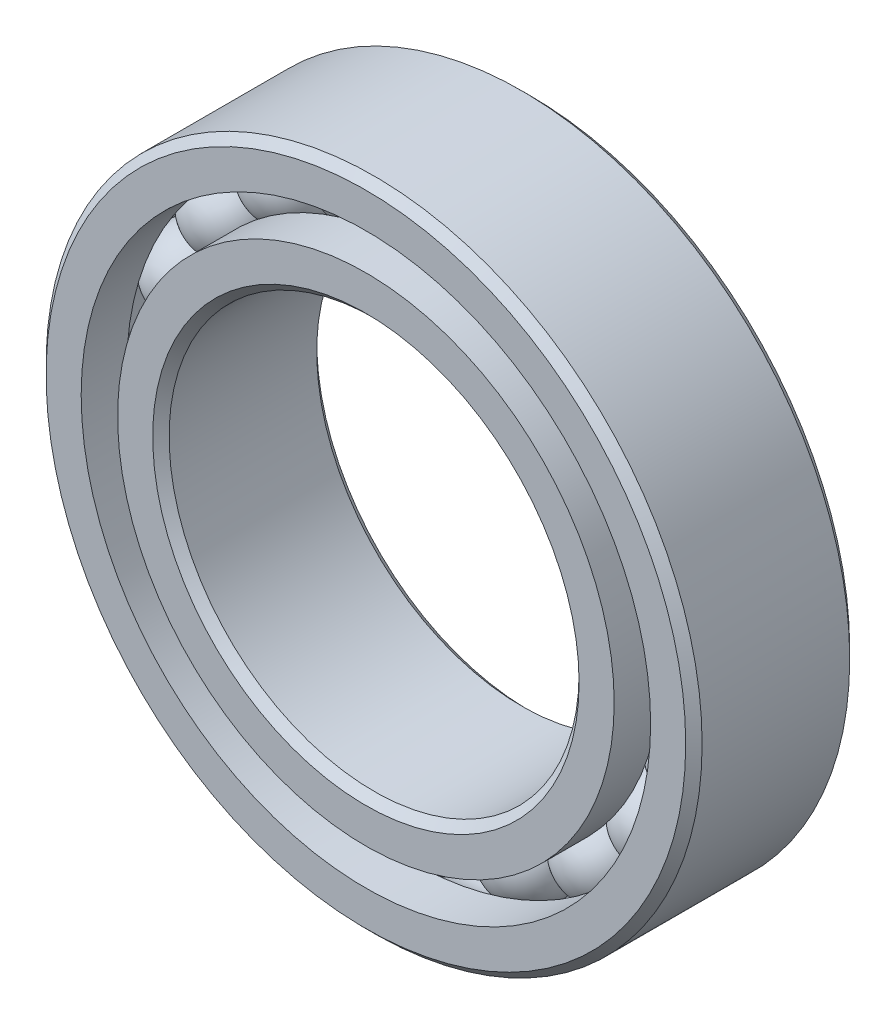
ISO-10303-21;
HEADER;
FILE_DESCRIPTION(('STEP AP214'),'2;1');
FILE_NAME('part.step','',(''),(''),'','','');
FILE_SCHEMA(('AUTOMOTIVE_DESIGN { 1 0 10303 214 1 1 1 1 }'));
ENDSEC;
DATA;
#1=APPLICATION_CONTEXT('core data for automotive mechanical design processes');
#2=APPLICATION_PROTOCOL_DEFINITION('international standard','automotive_design',2000,#1);
#3=PRODUCT_CONTEXT('',#1,'mechanical');
#4=PRODUCT('Part','Part','',(#3));
#5=PRODUCT_RELATED_PRODUCT_CATEGORY('part','',(#4));
#6=PRODUCT_DEFINITION_FORMATION('','',#4);
#7=PRODUCT_DEFINITION_CONTEXT('part definition',#1,'design');
#8=PRODUCT_DEFINITION('design','',#6,#7);
#9=PRODUCT_DEFINITION_SHAPE('','',#8);
#10=(LENGTH_UNIT() NAMED_UNIT(*) SI_UNIT(.MILLI.,.METRE.));
#11=(NAMED_UNIT(*) PLANE_ANGLE_UNIT() SI_UNIT($,.RADIAN.));
#12=(NAMED_UNIT(*) SI_UNIT($,.STERADIAN.) SOLID_ANGLE_UNIT());
#13=UNCERTAINTY_MEASURE_WITH_UNIT(LENGTH_MEASURE(1.E-05),#10,'distance_accuracy_value','');
#14=(GEOMETRIC_REPRESENTATION_CONTEXT(3) GLOBAL_UNCERTAINTY_ASSIGNED_CONTEXT((#13)) GLOBAL_UNIT_ASSIGNED_CONTEXT((#10,
#11,#12)) REPRESENTATION_CONTEXT('',''));
#15=CARTESIAN_POINT('',(0.,0.,0.));
#16=DIRECTION('',(0.,0.,1.));
#17=DIRECTION('',(1.,0.,0.));
#18=AXIS2_PLACEMENT_3D('',#15,#16,#17);
#19=CARTESIAN_POINT('',(-1.00430523171854,3.09093367795926,0.));
#20=DIRECTION('',(0.,0.,1.));
#21=DIRECTION('',(-0.309016994374935,0.951056516295158,0.));
#22=AXIS2_PLACEMENT_3D('',#19,#20,#21);
#23=SPHERICAL_SURFACE('',#22,0.496903994999954);
#24=CARTESIAN_POINT('',(-1.00430523171854,3.09093367795926,0.496903994999954));
#25=VERTEX_POINT('',#24);
#26=VERTEX_LOOP('',#25);
#27=FACE_BOUND('',#26,.T.);
#28=ADVANCED_FACE('F39',(#27),#23,.T.);
#29=CLOSED_SHELL('',(#28));
#30=MANIFOLD_SOLID_BREP('B2',#29);
#31=CARTESIAN_POINT('',(-1.9103020699505,2.6293052317186,0.));
#32=DIRECTION('',(0.,0.,1.));
#33=DIRECTION('',(-0.587785252292462,0.809016994374955,0.));
#34=AXIS2_PLACEMENT_3D('',#31,#32,#33);
#35=SPHERICAL_SURFACE('',#34,0.496903994999954);
#36=CARTESIAN_POINT('',(-1.9103020699505,2.6293052317186,0.496903994999954));
#37=VERTEX_POINT('',#36);
#38=VERTEX_LOOP('',#37);
#39=FACE_BOUND('',#38,.T.);
#40=ADVANCED_FACE('F57',(#39),#35,.T.);
#41=CLOSED_SHELL('',(#40));
#42=MANIFOLD_SOLID_BREP('B6',#41);
#43=CARTESIAN_POINT('',(-2.62930523171856,1.91030206995057,0.));
#44=DIRECTION('',(0.,0.,1.));
#45=DIRECTION('',(-0.80901699437494,0.587785252292483,0.));
#46=AXIS2_PLACEMENT_3D('',#43,#44,#45);
#47=SPHERICAL_SURFACE('',#46,0.496903994999954);
#48=CARTESIAN_POINT('',(-2.62930523171856,1.91030206995057,0.496903994999954));
#49=VERTEX_POINT('',#48);
#50=VERTEX_LOOP('',#49);
#51=FACE_BOUND('',#50,.T.);
#52=ADVANCED_FACE('F75',(#51),#47,.T.);
#53=CLOSED_SHELL('',(#52));
#54=MANIFOLD_SOLID_BREP('B35',#53);
#55=CARTESIAN_POINT('',(-3.09093367795924,1.00430523171861,0.));
#56=DIRECTION('',(0.,0.,1.));
#57=DIRECTION('',(-0.95105651629515,0.309016994374958,0.));
#58=AXIS2_PLACEMENT_3D('',#55,#56,#57);
#59=SPHERICAL_SURFACE('',#58,0.496903994999954);
#60=CARTESIAN_POINT('',(-3.09093367795924,1.00430523171861,0.496903994999954));
#61=VERTEX_POINT('',#60);
#62=VERTEX_LOOP('',#61);
#63=FACE_BOUND('',#62,.T.);
#64=ADVANCED_FACE('F93',(#63),#59,.T.);
#65=CLOSED_SHELL('',(#64));
#66=MANIFOLD_SOLID_BREP('B53',#65);
#67=CARTESIAN_POINT('',(-3.25,0.,0.));
#68=DIRECTION('',(0.,0.,1.));
#69=DIRECTION('',(-1.,0.,0.));
#70=AXIS2_PLACEMENT_3D('',#67,#68,#69);
#71=SPHERICAL_SURFACE('',#70,0.496903994999954);
#72=CARTESIAN_POINT('',(-3.25,0.,0.496903994999954));
#73=VERTEX_POINT('',#72);
#74=VERTEX_LOOP('',#73);
#75=FACE_BOUND('',#74,.T.);
#76=ADVANCED_FACE('F111',(#75),#71,.T.);
#77=CLOSED_SHELL('',(#76));
#78=MANIFOLD_SOLID_BREP('B71',#77);
#79=CARTESIAN_POINT('',(-3.09093367795926,-1.00430523171855,0.));
#80=DIRECTION('',(0.,0.,1.));
#81=DIRECTION('',(-0.951056516295157,-0.309016994374938,0.));
#82=AXIS2_PLACEMENT_3D('',#79,#80,#81);
#83=SPHERICAL_SURFACE('',#82,0.496903994999954);
#84=CARTESIAN_POINT('',(-3.09093367795926,-1.00430523171855,0.496903994999954));
#85=VERTEX_POINT('',#84);
#86=VERTEX_LOOP('',#85);
#87=FACE_BOUND('',#86,.T.);
#88=ADVANCED_FACE('F142',(#87),#83,.T.);
#89=CLOSED_SHELL('',(#88));
#90=MANIFOLD_SOLID_BREP('B89',#89);
#91=CARTESIAN_POINT('',(-2.6293052317186,-1.91030206995051,0.));
#92=DIRECTION('',(0.,0.,1.));
#93=DIRECTION('',(-0.809016994374953,-0.587785252292465,0.));
#94=AXIS2_PLACEMENT_3D('',#91,#92,#93);
#95=SPHERICAL_SURFACE('',#94,0.496903994999954);
#96=CARTESIAN_POINT('',(-2.6293052317186,-1.91030206995051,0.496903994999954));
#97=VERTEX_POINT('',#96);
#98=VERTEX_LOOP('',#97);
#99=FACE_BOUND('',#98,.T.);
#100=ADVANCED_FACE('F173',(#99),#95,.T.);
#101=CLOSED_SHELL('',(#100));
#102=MANIFOLD_SOLID_BREP('B107',#101);
#103=CARTESIAN_POINT('',(-1.91030206995056,-2.62930523171856,0.));
#104=DIRECTION('',(0.,0.,1.));
#105=DIRECTION('',(-0.58778525229248,-0.809016994374942,0.));
#106=AXIS2_PLACEMENT_3D('',#103,#104,#105);
#107=SPHERICAL_SURFACE('',#106,0.496903994999954);
#108=CARTESIAN_POINT('',(-1.91030206995056,-2.62930523171856,0.496903994999954));
#109=VERTEX_POINT('',#108);
#110=VERTEX_LOOP('',#109);
#111=FACE_BOUND('',#110,.T.);
#112=ADVANCED_FACE('F204',(#111),#107,.T.);
#113=CLOSED_SHELL('',(#112));
#114=MANIFOLD_SOLID_BREP('B138',#113);
#115=CARTESIAN_POINT('',(-1.0043052317186,-3.09093367795924,0.));
#116=DIRECTION('',(0.,0.,1.));
#117=DIRECTION('',(-0.309016994374955,-0.951056516295151,0.));
#118=AXIS2_PLACEMENT_3D('',#115,#116,#117);
#119=SPHERICAL_SURFACE('',#118,0.496903994999954);
#120=CARTESIAN_POINT('',(-1.0043052317186,-3.09093367795924,0.496903994999954));
#121=VERTEX_POINT('',#120);
#122=VERTEX_LOOP('',#121);
#123=FACE_BOUND('',#122,.T.);
#124=ADVANCED_FACE('F235',(#123),#119,.T.);
#125=CLOSED_SHELL('',(#124));
#126=MANIFOLD_SOLID_BREP('B169',#125);
#127=CARTESIAN_POINT('',(0.,-3.25,0.));
#128=DIRECTION('',(0.,0.,1.));
#129=DIRECTION('',(0.,-1.,0.));
#130=AXIS2_PLACEMENT_3D('',#127,#128,#129);
#131=SPHERICAL_SURFACE('',#130,0.496903994999954);
#132=CARTESIAN_POINT('',(0.,-3.25,0.496903994999954));
#133=VERTEX_POINT('',#132);
#134=VERTEX_LOOP('',#133);
#135=FACE_BOUND('',#134,.T.);
#136=ADVANCED_FACE('F266',(#135),#131,.T.);
#137=CLOSED_SHELL('',(#136));
#138=MANIFOLD_SOLID_BREP('B200',#137);
#139=CARTESIAN_POINT('',(1.00430523171856,-3.09093367795926,0.));
#140=DIRECTION('',(0.,0.,1.));
#141=DIRECTION('',(0.309016994374941,-0.951056516295156,0.));
#142=AXIS2_PLACEMENT_3D('',#139,#140,#141);
#143=SPHERICAL_SURFACE('',#142,0.496903994999954);
#144=CARTESIAN_POINT('',(1.00430523171856,-3.09093367795926,0.496903994999954));
#145=VERTEX_POINT('',#144);
#146=VERTEX_LOOP('',#145);
#147=FACE_BOUND('',#146,.T.);
#148=ADVANCED_FACE('F297',(#147),#143,.T.);
#149=CLOSED_SHELL('',(#148));
#150=MANIFOLD_SOLID_BREP('B231',#149);
#151=CARTESIAN_POINT('',(1.91030206995052,-2.62930523171859,0.));
#152=DIRECTION('',(0.,0.,1.));
#153=DIRECTION('',(0.587785252292469,-0.809016994374951,0.));
#154=AXIS2_PLACEMENT_3D('',#151,#152,#153);
#155=SPHERICAL_SURFACE('',#154,0.496903994999954);
#156=CARTESIAN_POINT('',(1.91030206995052,-2.62930523171859,0.496903994999954));
#157=VERTEX_POINT('',#156);
#158=VERTEX_LOOP('',#157);
#159=FACE_BOUND('',#158,.T.);
#160=ADVANCED_FACE('F328',(#159),#155,.T.);
#161=CLOSED_SHELL('',(#160));
#162=MANIFOLD_SOLID_BREP('B262',#161);
#163=CARTESIAN_POINT('',(2.62930523171857,-1.91030206995055,0.));
#164=DIRECTION('',(0.,0.,1.));
#165=DIRECTION('',(0.809016994374945,-0.587785252292477,0.));
#166=AXIS2_PLACEMENT_3D('',#163,#164,#165);
#167=SPHERICAL_SURFACE('',#166,0.496903994999954);
#168=CARTESIAN_POINT('',(2.62930523171857,-1.91030206995055,0.496903994999954));
#169=VERTEX_POINT('',#168);
#170=VERTEX_LOOP('',#169);
#171=FACE_BOUND('',#170,.T.);
#172=ADVANCED_FACE('F359',(#171),#167,.T.);
#173=CLOSED_SHELL('',(#172));
#174=MANIFOLD_SOLID_BREP('B293',#173);
#175=CARTESIAN_POINT('',(3.09093367795925,-1.00430523171859,0.));
#176=DIRECTION('',(0.,0.,1.));
#177=DIRECTION('',(0.951056516295152,-0.309016994374952,0.));
#178=AXIS2_PLACEMENT_3D('',#175,#176,#177);
#179=SPHERICAL_SURFACE('',#178,0.496903994999954);
#180=CARTESIAN_POINT('',(3.09093367795925,-1.00430523171859,0.496903994999954));
#181=VERTEX_POINT('',#180);
#182=VERTEX_LOOP('',#181);
#183=FACE_BOUND('',#182,.T.);
#184=ADVANCED_FACE('F390',(#183),#179,.T.);
#185=CLOSED_SHELL('',(#184));
#186=MANIFOLD_SOLID_BREP('B324',#185);
#187=CARTESIAN_POINT('',(3.25,0.,0.));
#188=DIRECTION('',(0.,0.,1.));
#189=DIRECTION('',(1.,0.,0.));
#190=AXIS2_PLACEMENT_3D('',#187,#188,#189);
#191=SPHERICAL_SURFACE('',#190,0.496903994999954);
#192=CARTESIAN_POINT('',(3.25,0.,0.496903994999954));
#193=VERTEX_POINT('',#192);
#194=VERTEX_LOOP('',#193);
#195=FACE_BOUND('',#194,.T.);
#196=ADVANCED_FACE('F421',(#195),#191,.T.);
#197=CLOSED_SHELL('',(#196));
#198=MANIFOLD_SOLID_BREP('B355',#197);
#199=CARTESIAN_POINT('',(3.09093367795925,1.00430523171857,0.));
#200=DIRECTION('',(0.,0.,1.));
#201=DIRECTION('',(0.951056516295155,0.309016994374945,0.));
#202=AXIS2_PLACEMENT_3D('',#199,#200,#201);
#203=SPHERICAL_SURFACE('',#202,0.496903994999954);
#204=CARTESIAN_POINT('',(3.09093367795925,1.00430523171857,0.496903994999954));
#205=VERTEX_POINT('',#204);
#206=VERTEX_LOOP('',#205);
#207=FACE_BOUND('',#206,.T.);
#208=ADVANCED_FACE('F452',(#207),#203,.T.);
#209=CLOSED_SHELL('',(#208));
#210=MANIFOLD_SOLID_BREP('B386',#209);
#211=CARTESIAN_POINT('',(2.62930523171858,1.91030206995053,0.));
#212=DIRECTION('',(0.,0.,1.));
#213=DIRECTION('',(0.809016994374949,0.587785252292471,0.));
#214=AXIS2_PLACEMENT_3D('',#211,#212,#213);
#215=SPHERICAL_SURFACE('',#214,0.496903994999954);
#216=CARTESIAN_POINT('',(2.62930523171858,1.91030206995053,0.496903994999954));
#217=VERTEX_POINT('',#216);
#218=VERTEX_LOOP('',#217);
#219=FACE_BOUND('',#218,.T.);
#220=ADVANCED_FACE('F483',(#219),#215,.T.);
#221=CLOSED_SHELL('',(#220));
#222=MANIFOLD_SOLID_BREP('B417',#221);
#223=CARTESIAN_POINT('',(1.91030206995054,2.62930523171858,0.));
#224=DIRECTION('',(0.,0.,1.));
#225=DIRECTION('',(0.587785252292474,0.809016994374947,0.));
#226=AXIS2_PLACEMENT_3D('',#223,#224,#225);
#227=SPHERICAL_SURFACE('',#226,0.496903994999954);
#228=CARTESIAN_POINT('',(1.91030206995054,2.62930523171858,0.496903994999954));
#229=VERTEX_POINT('',#228);
#230=VERTEX_LOOP('',#229);
#231=FACE_BOUND('',#230,.T.);
#232=ADVANCED_FACE('F514',(#231),#227,.T.);
#233=CLOSED_SHELL('',(#232));
#234=MANIFOLD_SOLID_BREP('B448',#233);
#235=CARTESIAN_POINT('',(1.00430523171858,3.09093367795925,0.));
#236=DIRECTION('',(0.,0.,1.));
#237=DIRECTION('',(0.309016994374948,0.951056516295154,0.));
#238=AXIS2_PLACEMENT_3D('',#235,#236,#237);
#239=SPHERICAL_SURFACE('',#238,0.496903994999954);
#240=CARTESIAN_POINT('',(1.00430523171858,3.09093367795925,0.496903994999954));
#241=VERTEX_POINT('',#240);
#242=VERTEX_LOOP('',#241);
#243=FACE_BOUND('',#242,.T.);
#244=ADVANCED_FACE('F545',(#243),#239,.T.);
#245=CLOSED_SHELL('',(#244));
#246=MANIFOLD_SOLID_BREP('B479',#245);
#247=CARTESIAN_POINT('',(0.,3.25,0.));
#248=DIRECTION('',(0.,0.,1.));
#249=DIRECTION('',(0.,1.,0.));
#250=AXIS2_PLACEMENT_3D('',#247,#248,#249);
#251=SPHERICAL_SURFACE('',#250,0.496903994999954);
#252=CARTESIAN_POINT('',(0.,3.25,0.496903994999954));
#253=VERTEX_POINT('',#252);
#254=VERTEX_LOOP('',#253);
#255=FACE_BOUND('',#254,.T.);
#256=ADVANCED_FACE('F578',(#255),#251,.T.);
#257=CLOSED_SHELL('',(#256));
#258=MANIFOLD_SOLID_BREP('B510',#257);
#259=CARTESIAN_POINT('',(0.,0.,0.900000000000001));
#260=DIRECTION('',(0.,0.,-1.));
#261=DIRECTION('',(-1.,0.,0.));
#262=AXIS2_PLACEMENT_3D('',#259,#260,#261);
#263=CONICAL_SURFACE('',#262,4.,0.785398163397447);
#264=CARTESIAN_POINT('',(0.,0.,1.));
#265=DIRECTION('',(0.,0.,1.));
#266=DIRECTION('',(1.,0.,0.));
#267=AXIS2_PLACEMENT_3D('',#264,#265,#266);
#268=CIRCLE('',#267,3.9);
#269=CARTESIAN_POINT('',(3.9,0.,1.));
#270=VERTEX_POINT('',#269);
#271=EDGE_CURVE('E625',#270,#270,#268,.T.);
#272=ORIENTED_EDGE('',*,*,#271,.F.);
#273=EDGE_LOOP('',(#272));
#274=FACE_BOUND('',#273,.T.);
#275=CARTESIAN_POINT('',(0.,0.,0.900000000000001));
#276=DIRECTION('',(0.,0.,1.));
#277=DIRECTION('',(1.,0.,0.));
#278=AXIS2_PLACEMENT_3D('',#275,#276,#277);
#279=CIRCLE('',#278,4.);
#280=CARTESIAN_POINT('',(4.,0.,0.900000000000001));
#281=VERTEX_POINT('',#280);
#282=EDGE_CURVE('E577',#281,#281,#279,.T.);
#283=ORIENTED_EDGE('',*,*,#282,.T.);
#284=EDGE_LOOP('',(#283));
#285=FACE_BOUND('',#284,.T.);
#286=ADVANCED_FACE('F597',(#274,#285),#263,.T.);
#287=CARTESIAN_POINT('',(0.,0.,1.));
#288=DIRECTION('',(0.,0.,1.));
#289=DIRECTION('',(1.,0.,0.));
#290=AXIS2_PLACEMENT_3D('',#287,#288,#289);
#291=CYLINDRICAL_SURFACE('',#290,4.);
#292=ORIENTED_EDGE('',*,*,#282,.F.);
#293=EDGE_LOOP('',(#292));
#294=FACE_BOUND('',#293,.T.);
#295=CARTESIAN_POINT('',(0.,0.,-0.9));
#296=DIRECTION('',(0.,0.,1.));
#297=DIRECTION('',(1.,0.,0.));
#298=AXIS2_PLACEMENT_3D('',#295,#296,#297);
#299=CIRCLE('',#298,4.);
#300=CARTESIAN_POINT('',(4.,0.,-0.9));
#301=VERTEX_POINT('',#300);
#302=EDGE_CURVE('E603',#301,#301,#299,.T.);
#303=ORIENTED_EDGE('',*,*,#302,.T.);
#304=EDGE_LOOP('',(#303));
#305=FACE_BOUND('',#304,.T.);
#306=ADVANCED_FACE('F632',(#294,#305),#291,.T.);
#307=CARTESIAN_POINT('',(0.,0.,-1.));
#308=DIRECTION('',(0.,0.,1.));
#309=DIRECTION('',(1.,0.,0.));
#310=AXIS2_PLACEMENT_3D('',#307,#308,#309);
#311=CONICAL_SURFACE('',#310,3.9,0.785398163397446);
#312=ORIENTED_EDGE('',*,*,#302,.F.);
#313=EDGE_LOOP('',(#312));
#314=FACE_BOUND('',#313,.T.);
#315=CARTESIAN_POINT('',(0.,0.,-1.));
#316=DIRECTION('',(0.,0.,1.));
#317=DIRECTION('',(1.,0.,0.));
#318=AXIS2_PLACEMENT_3D('',#315,#316,#317);
#319=CIRCLE('',#318,3.9);
#320=CARTESIAN_POINT('',(3.9,0.,-1.));
#321=VERTEX_POINT('',#320);
#322=EDGE_CURVE('E607',#321,#321,#319,.T.);
#323=ORIENTED_EDGE('',*,*,#322,.T.);
#324=EDGE_LOOP('',(#323));
#325=FACE_BOUND('',#324,.T.);
#326=ADVANCED_FACE('F636',(#314,#325),#311,.T.);
#327=CARTESIAN_POINT('',(0.,3.9,-1.));
#328=DIRECTION('',(0.,0.,1.));
#329=DIRECTION('',(1.,0.,0.));
#330=AXIS2_PLACEMENT_3D('',#327,#328,#329);
#331=PLANE('',#330);
#332=ORIENTED_EDGE('',*,*,#322,.F.);
#333=EDGE_LOOP('',(#332));
#334=FACE_BOUND('',#333,.T.);
#335=CARTESIAN_POINT('',(0.,0.,-1.));
#336=DIRECTION('',(0.,0.,1.));
#337=DIRECTION('',(1.,0.,0.));
#338=AXIS2_PLACEMENT_3D('',#335,#336,#337);
#339=CIRCLE('',#338,3.47222222222222);
#340=CARTESIAN_POINT('',(3.47222222222222,0.,-1.));
#341=VERTEX_POINT('',#340);
#342=EDGE_CURVE('E611',#341,#341,#339,.T.);
#343=ORIENTED_EDGE('',*,*,#342,.T.);
#344=EDGE_LOOP('',(#343));
#345=FACE_BOUND('',#344,.T.);
#346=ADVANCED_FACE('F641',(#334,#345),#331,.F.);
#347=CARTESIAN_POINT('',(0.,0.,1.));
#348=DIRECTION('',(0.,0.,1.));
#349=DIRECTION('',(1.,0.,0.));
#350=AXIS2_PLACEMENT_3D('',#347,#348,#349);
#351=CYLINDRICAL_SURFACE('',#350,3.47222222222222);
#352=ORIENTED_EDGE('',*,*,#342,.F.);
#353=EDGE_LOOP('',(#352));
#354=FACE_BOUND('',#353,.T.);
#355=CARTESIAN_POINT('',(0.,0.,-0.444444444444444));
#356=DIRECTION('',(0.,0.,1.));
#357=DIRECTION('',(1.,0.,0.));
#358=AXIS2_PLACEMENT_3D('',#355,#356,#357);
#359=CIRCLE('',#358,3.47222222222222);
#360=CARTESIAN_POINT('',(3.47222222222222,0.,-0.444444444444444));
#361=VERTEX_POINT('',#360);
#362=EDGE_CURVE('E616',#361,#361,#359,.T.);
#363=ORIENTED_EDGE('',*,*,#362,.T.);
#364=EDGE_LOOP('',(#363));
#365=FACE_BOUND('',#364,.T.);
#366=ADVANCED_FACE('F647',(#354,#365),#351,.F.);
#367=CARTESIAN_POINT('',(0.,0.,0.));
#368=DIRECTION('',(0.,0.,1.));
#369=DIRECTION('',(1.,0.,0.));
#370=AXIS2_PLACEMENT_3D('',#367,#368,#369);
#371=TOROIDAL_SURFACE('',#370,3.25,0.496903994999952);
#372=ORIENTED_EDGE('',*,*,#362,.F.);
#373=EDGE_LOOP('',(#372));
#374=FACE_BOUND('',#373,.T.);
#375=CARTESIAN_POINT('',(0.,0.,0.444444444444445));
#376=DIRECTION('',(0.,0.,1.));
#377=DIRECTION('',(1.,0.,0.));
#378=AXIS2_PLACEMENT_3D('',#375,#376,#377);
#379=CIRCLE('',#378,3.47222222222222);
#380=CARTESIAN_POINT('',(3.47222222222222,0.,0.444444444444445));
#381=VERTEX_POINT('',#380);
#382=EDGE_CURVE('E619',#381,#381,#379,.T.);
#383=ORIENTED_EDGE('',*,*,#382,.T.);
#384=EDGE_LOOP('',(#383));
#385=FACE_BOUND('',#384,.T.);
#386=ADVANCED_FACE('F651',(#374,#385),#371,.F.);
#387=CARTESIAN_POINT('',(0.,0.,1.));
#388=DIRECTION('',(0.,0.,1.));
#389=DIRECTION('',(1.,0.,0.));
#390=AXIS2_PLACEMENT_3D('',#387,#388,#389);
#391=CYLINDRICAL_SURFACE('',#390,3.47222222222222);
#392=ORIENTED_EDGE('',*,*,#382,.F.);
#393=EDGE_LOOP('',(#392));
#394=FACE_BOUND('',#393,.T.);
#395=CARTESIAN_POINT('',(0.,0.,1.));
#396=DIRECTION('',(0.,0.,1.));
#397=DIRECTION('',(1.,0.,0.));
#398=AXIS2_PLACEMENT_3D('',#395,#396,#397);
#399=CIRCLE('',#398,3.47222222222222);
#400=CARTESIAN_POINT('',(3.47222222222222,0.,1.));
#401=VERTEX_POINT('',#400);
#402=EDGE_CURVE('E622',#401,#401,#399,.T.);
#403=ORIENTED_EDGE('',*,*,#402,.T.);
#404=EDGE_LOOP('',(#403));
#405=FACE_BOUND('',#404,.T.);
#406=ADVANCED_FACE('F655',(#394,#405),#391,.F.);
#407=CARTESIAN_POINT('',(0.,3.9,1.));
#408=DIRECTION('',(0.,0.,-1.));
#409=DIRECTION('',(-1.,0.,0.));
#410=AXIS2_PLACEMENT_3D('',#407,#408,#409);
#411=PLANE('',#410);
#412=ORIENTED_EDGE('',*,*,#402,.F.);
#413=EDGE_LOOP('',(#412));
#414=FACE_BOUND('',#413,.T.);
#415=ORIENTED_EDGE('',*,*,#271,.T.);
#416=EDGE_LOOP('',(#415));
#417=FACE_BOUND('',#416,.T.);
#418=ADVANCED_FACE('F629',(#414,#417),#411,.F.);
#419=CLOSED_SHELL('',(#286,#306,#326,#346,#366,#386,#406,#418));
#420=MANIFOLD_SOLID_BREP('B541',#419);
#421=CARTESIAN_POINT('',(0.,3.02777777777778,1.));
#422=DIRECTION('',(0.,0.,-1.));
#423=DIRECTION('',(-1.,0.,0.));
#424=AXIS2_PLACEMENT_3D('',#421,#422,#423);
#425=PLANE('',#424);
#426=CARTESIAN_POINT('',(0.,0.,1.));
#427=DIRECTION('',(0.,0.,1.));
#428=DIRECTION('',(1.,0.,0.));
#429=AXIS2_PLACEMENT_3D('',#426,#427,#428);
#430=CIRCLE('',#429,2.6);
#431=CARTESIAN_POINT('',(2.6,0.,1.));
#432=VERTEX_POINT('',#431);
#433=EDGE_CURVE('E596',#432,#432,#430,.T.);
#434=ORIENTED_EDGE('',*,*,#433,.F.);
#435=EDGE_LOOP('',(#434));
#436=FACE_BOUND('',#435,.T.);
#437=CARTESIAN_POINT('',(0.,0.,1.));
#438=DIRECTION('',(0.,0.,1.));
#439=DIRECTION('',(1.,0.,0.));
#440=AXIS2_PLACEMENT_3D('',#437,#438,#439);
#441=CIRCLE('',#440,3.02777777777778);
#442=CARTESIAN_POINT('',(3.02777777777778,0.,1.));
#443=VERTEX_POINT('',#442);
#444=EDGE_CURVE('E746',#443,#443,#441,.T.);
#445=ORIENTED_EDGE('',*,*,#444,.T.);
#446=EDGE_LOOP('',(#445));
#447=FACE_BOUND('',#446,.T.);
#448=ADVANCED_FACE('F718',(#436,#447),#425,.F.);
#449=CARTESIAN_POINT('',(0.,0.,1.));
#450=DIRECTION('',(0.,0.,1.));
#451=DIRECTION('',(1.,0.,0.));
#452=AXIS2_PLACEMENT_3D('',#449,#450,#451);
#453=CONICAL_SURFACE('',#452,2.6,0.785398163397448);
#454=CARTESIAN_POINT('',(0.,0.,0.9));
#455=DIRECTION('',(0.,0.,1.));
#456=DIRECTION('',(1.,0.,0.));
#457=AXIS2_PLACEMENT_3D('',#454,#455,#456);
#458=CIRCLE('',#457,2.5);
#459=CARTESIAN_POINT('',(2.5,0.,0.9));
#460=VERTEX_POINT('',#459);
#461=EDGE_CURVE('E724',#460,#460,#458,.T.);
#462=ORIENTED_EDGE('',*,*,#461,.F.);
#463=EDGE_LOOP('',(#462));
#464=FACE_BOUND('',#463,.T.);
#465=ORIENTED_EDGE('',*,*,#433,.T.);
#466=EDGE_LOOP('',(#465));
#467=FACE_BOUND('',#466,.T.);
#468=ADVANCED_FACE('F783',(#464,#467),#453,.F.);
#469=CARTESIAN_POINT('',(0.,0.,1.));
#470=DIRECTION('',(0.,0.,1.));
#471=DIRECTION('',(1.,0.,0.));
#472=AXIS2_PLACEMENT_3D('',#469,#470,#471);
#473=CYLINDRICAL_SURFACE('',#472,2.5);
#474=CARTESIAN_POINT('',(0.,0.,-0.900000000000001));
#475=DIRECTION('',(0.,0.,1.));
#476=DIRECTION('',(1.,0.,0.));
#477=AXIS2_PLACEMENT_3D('',#474,#475,#476);
#478=CIRCLE('',#477,2.5);
#479=CARTESIAN_POINT('',(2.5,0.,-0.900000000000001));
#480=VERTEX_POINT('',#479);
#481=EDGE_CURVE('E728',#480,#480,#478,.T.);
#482=ORIENTED_EDGE('',*,*,#481,.F.);
#483=EDGE_LOOP('',(#482));
#484=FACE_BOUND('',#483,.T.);
#485=ORIENTED_EDGE('',*,*,#461,.T.);
#486=EDGE_LOOP('',(#485));
#487=FACE_BOUND('',#486,.T.);
#488=ADVANCED_FACE('F778',(#484,#487),#473,.F.);
#489=CARTESIAN_POINT('',(0.,0.,-0.900000000000001));
#490=DIRECTION('',(0.,0.,-1.));
#491=DIRECTION('',(-1.,0.,0.));
#492=AXIS2_PLACEMENT_3D('',#489,#490,#491);
#493=CONICAL_SURFACE('',#492,2.5,0.785398163397448);
#494=CARTESIAN_POINT('',(0.,0.,-1.));
#495=DIRECTION('',(0.,0.,1.));
#496=DIRECTION('',(1.,0.,0.));
#497=AXIS2_PLACEMENT_3D('',#494,#495,#496);
#498=CIRCLE('',#497,2.6);
#499=CARTESIAN_POINT('',(2.6,0.,-1.));
#500=VERTEX_POINT('',#499);
#501=EDGE_CURVE('E732',#500,#500,#498,.T.);
#502=ORIENTED_EDGE('',*,*,#501,.F.);
#503=EDGE_LOOP('',(#502));
#504=FACE_BOUND('',#503,.T.);
#505=ORIENTED_EDGE('',*,*,#481,.T.);
#506=EDGE_LOOP('',(#505));
#507=FACE_BOUND('',#506,.T.);
#508=ADVANCED_FACE('F772',(#504,#507),#493,.F.);
#509=CARTESIAN_POINT('',(0.,3.02777777777778,-1.));
#510=DIRECTION('',(0.,0.,1.));
#511=DIRECTION('',(1.,0.,0.));
#512=AXIS2_PLACEMENT_3D('',#509,#510,#511);
#513=PLANE('',#512);
#514=CARTESIAN_POINT('',(0.,0.,-1.));
#515=DIRECTION('',(0.,0.,1.));
#516=DIRECTION('',(1.,0.,0.));
#517=AXIS2_PLACEMENT_3D('',#514,#515,#516);
#518=CIRCLE('',#517,3.02777777777778);
#519=CARTESIAN_POINT('',(3.02777777777778,0.,-1.));
#520=VERTEX_POINT('',#519);
#521=EDGE_CURVE('E737',#520,#520,#518,.T.);
#522=ORIENTED_EDGE('',*,*,#521,.F.);
#523=EDGE_LOOP('',(#522));
#524=FACE_BOUND('',#523,.T.);
#525=ORIENTED_EDGE('',*,*,#501,.T.);
#526=EDGE_LOOP('',(#525));
#527=FACE_BOUND('',#526,.T.);
#528=ADVANCED_FACE('F766',(#524,#527),#513,.F.);
#529=CARTESIAN_POINT('',(0.,0.,1.));
#530=DIRECTION('',(0.,0.,1.));
#531=DIRECTION('',(1.,0.,0.));
#532=AXIS2_PLACEMENT_3D('',#529,#530,#531);
#533=CYLINDRICAL_SURFACE('',#532,3.02777777777778);
#534=CARTESIAN_POINT('',(0.,0.,-0.444444444444444));
#535=DIRECTION('',(0.,0.,1.));
#536=DIRECTION('',(1.,0.,0.));
#537=AXIS2_PLACEMENT_3D('',#534,#535,#536);
#538=CIRCLE('',#537,3.02777777777778);
#539=CARTESIAN_POINT('',(3.02777777777778,0.,-0.444444444444444));
#540=VERTEX_POINT('',#539);
#541=EDGE_CURVE('E740',#540,#540,#538,.T.);
#542=ORIENTED_EDGE('',*,*,#541,.F.);
#543=EDGE_LOOP('',(#542));
#544=FACE_BOUND('',#543,.T.);
#545=ORIENTED_EDGE('',*,*,#521,.T.);
#546=EDGE_LOOP('',(#545));
#547=FACE_BOUND('',#546,.T.);
#548=ADVANCED_FACE('F760',(#544,#547),#533,.T.);
#549=CARTESIAN_POINT('',(0.,0.,0.));
#550=DIRECTION('',(0.,0.,1.));
#551=DIRECTION('',(1.,0.,0.));
#552=AXIS2_PLACEMENT_3D('',#549,#550,#551);
#553=TOROIDAL_SURFACE('',#552,3.25,0.496903994999953);
#554=CARTESIAN_POINT('',(0.,0.,0.444444444444444));
#555=DIRECTION('',(0.,0.,1.));
#556=DIRECTION('',(1.,0.,0.));
#557=AXIS2_PLACEMENT_3D('',#554,#555,#556);
#558=CIRCLE('',#557,3.02777777777778);
#559=CARTESIAN_POINT('',(3.02777777777778,0.,0.444444444444444));
#560=VERTEX_POINT('',#559);
#561=EDGE_CURVE('E743',#560,#560,#558,.T.);
#562=ORIENTED_EDGE('',*,*,#561,.F.);
#563=EDGE_LOOP('',(#562));
#564=FACE_BOUND('',#563,.T.);
#565=ORIENTED_EDGE('',*,*,#541,.T.);
#566=EDGE_LOOP('',(#565));
#567=FACE_BOUND('',#566,.T.);
#568=ADVANCED_FACE('F754',(#564,#567),#553,.F.);
#569=CARTESIAN_POINT('',(0.,0.,1.));
#570=DIRECTION('',(0.,0.,1.));
#571=DIRECTION('',(1.,0.,0.));
#572=AXIS2_PLACEMENT_3D('',#569,#570,#571);
#573=CYLINDRICAL_SURFACE('',#572,3.02777777777778);
#574=ORIENTED_EDGE('',*,*,#444,.F.);
#575=EDGE_LOOP('',(#574));
#576=FACE_BOUND('',#575,.T.);
#577=ORIENTED_EDGE('',*,*,#561,.T.);
#578=EDGE_LOOP('',(#577));
#579=FACE_BOUND('',#578,.T.);
#580=ADVANCED_FACE('F751',(#576,#579),#573,.T.);
#581=CLOSED_SHELL('',(#448,#468,#488,#508,#528,#548,#568,#580));
#582=MANIFOLD_SOLID_BREP('B572',#581);
#583=ADVANCED_BREP_SHAPE_REPRESENTATION('',(#18,#30,#42,#54,#66,#78,#90,#102,#114,#126,#138,
#150,#162,#174,#186,#198,#210,#222,#234,#246,#258,#420,#582),#14);
#584=SHAPE_DEFINITION_REPRESENTATION(#9,#583);
ENDSEC;
END-ISO-10303-21;
